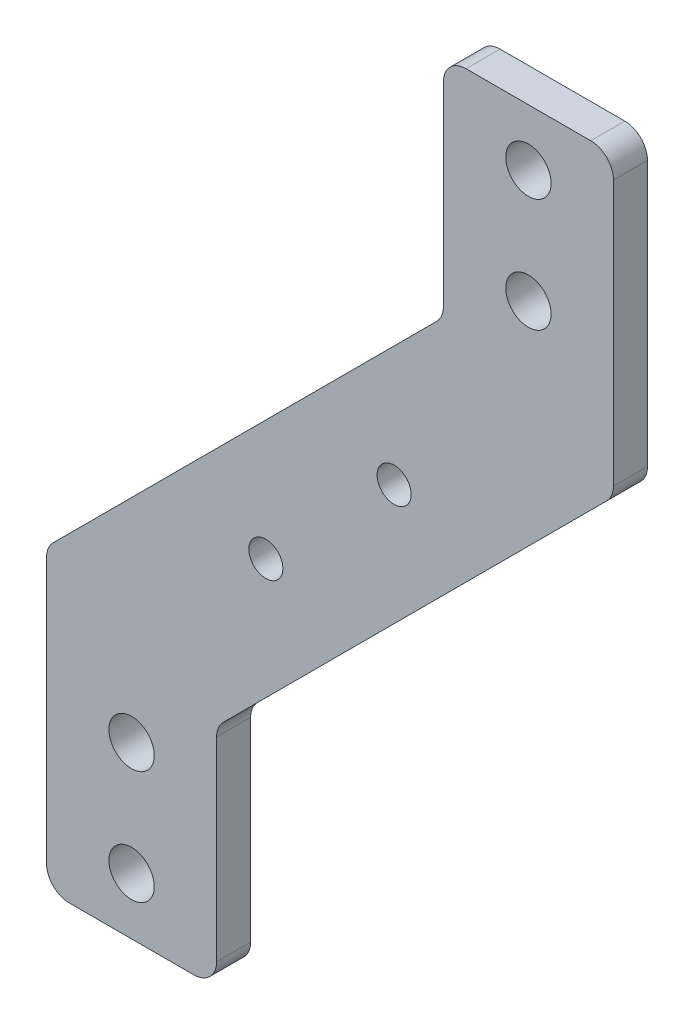
ISO-10303-21;
HEADER;
FILE_DESCRIPTION(('STEP AP214'),'2;1');
FILE_NAME('part.step','',(''),(''),'','','');
FILE_SCHEMA(('AUTOMOTIVE_DESIGN { 1 0 10303 214 1 1 1 1 }'));
ENDSEC;
DATA;
#1=APPLICATION_CONTEXT('core data for automotive mechanical design processes');
#2=APPLICATION_PROTOCOL_DEFINITION('international standard','automotive_design',2000,#1);
#3=PRODUCT_CONTEXT('',#1,'mechanical');
#4=PRODUCT('Part','Part','',(#3));
#5=PRODUCT_RELATED_PRODUCT_CATEGORY('part','',(#4));
#6=PRODUCT_DEFINITION_FORMATION('','',#4);
#7=PRODUCT_DEFINITION_CONTEXT('part definition',#1,'design');
#8=PRODUCT_DEFINITION('design','',#6,#7);
#9=PRODUCT_DEFINITION_SHAPE('','',#8);
#10=(LENGTH_UNIT() NAMED_UNIT(*) SI_UNIT(.MILLI.,.METRE.));
#11=(NAMED_UNIT(*) PLANE_ANGLE_UNIT() SI_UNIT($,.RADIAN.));
#12=(NAMED_UNIT(*) SI_UNIT($,.STERADIAN.) SOLID_ANGLE_UNIT());
#13=UNCERTAINTY_MEASURE_WITH_UNIT(LENGTH_MEASURE(1.E-05),#10,'distance_accuracy_value','');
#14=(GEOMETRIC_REPRESENTATION_CONTEXT(3) GLOBAL_UNCERTAINTY_ASSIGNED_CONTEXT((#13)) GLOBAL_UNIT_ASSIGNED_CONTEXT((#10,
#11,#12)) REPRESENTATION_CONTEXT('',''));
#15=CARTESIAN_POINT('',(0.,0.,0.));
#16=DIRECTION('',(0.,0.,1.));
#17=DIRECTION('',(1.,0.,0.));
#18=AXIS2_PLACEMENT_3D('',#15,#16,#17);
#19=CARTESIAN_POINT('',(0.,0.,3.));
#20=DIRECTION('',(0.,0.,-1.));
#21=DIRECTION('',(-1.,0.,0.));
#22=AXIS2_PLACEMENT_3D('',#19,#20,#21);
#23=PLANE('',#22);
#24=CARTESIAN_POINT('',(15.6568542494867,46.2634559672881,3.));
#25=DIRECTION('',(0.,0.,-1.));
#26=DIRECTION('',(-1.,0.,0.));
#27=AXIS2_PLACEMENT_3D('',#24,#25,#26);
#28=CIRCLE('',#27,1.5);
#29=CARTESIAN_POINT('',(14.1568542494867,46.2634559672881,3.));
#30=VERTEX_POINT('',#29);
#31=EDGE_CURVE('E415',#30,#30,#28,.T.);
#32=ORIENTED_EDGE('',*,*,#31,.T.);
#33=EDGE_LOOP('',(#32));
#34=FACE_BOUND('',#33,.T.);
#35=CARTESIAN_POINT('',(4.34314575050198,34.9497474683034,3.));
#36=DIRECTION('',(0.,0.,-1.));
#37=DIRECTION('',(-1.,0.,0.));
#38=AXIS2_PLACEMENT_3D('',#35,#36,#37);
#39=CIRCLE('',#38,1.5);
#40=CARTESIAN_POINT('',(2.84314575050198,34.9497474683034,3.));
#41=VERTEX_POINT('',#40);
#42=EDGE_CURVE('E420',#41,#41,#39,.T.);
#43=ORIENTED_EDGE('',*,*,#42,.T.);
#44=EDGE_LOOP('',(#43));
#45=FACE_BOUND('',#44,.T.);
#46=DIRECTION('',(1.,0.,0.));
#47=VECTOR('',#46,1.);
#48=CARTESIAN_POINT('',(0.,0.,3.));
#49=LINE('',#48,#47);
#50=CARTESIAN_POINT('',(-13.,0.,3.));
#51=VERTEX_POINT('',#50);
#52=CARTESIAN_POINT('',(-2.,0.,3.));
#53=VERTEX_POINT('',#52);
#54=EDGE_CURVE('E185',#51,#53,#49,.T.);
#55=ORIENTED_EDGE('',*,*,#54,.T.);
#56=CARTESIAN_POINT('',(-2.,2.,3.));
#57=DIRECTION('',(0.,0.,-1.));
#58=DIRECTION('',(-1.,0.,0.));
#59=AXIS2_PLACEMENT_3D('',#56,#57,#58);
#60=CIRCLE('',#59,2.);
#61=CARTESIAN_POINT('',(0.,2.,3.));
#62=VERTEX_POINT('',#61);
#63=EDGE_CURVE('E224',#53,#62,#60,.F.);
#64=ORIENTED_EDGE('',*,*,#63,.T.);
#65=DIRECTION('',(0.,1.,0.));
#66=VECTOR('',#65,1.);
#67=CARTESIAN_POINT('',(0.,20.,3.));
#68=LINE('',#67,#66);
#69=CARTESIAN_POINT('',(0.,19.1715728752538,3.));
#70=VERTEX_POINT('',#69);
#71=EDGE_CURVE('E168',#62,#70,#68,.T.);
#72=ORIENTED_EDGE('',*,*,#71,.T.);
#73=CARTESIAN_POINT('',(2.,19.1715728752538,3.));
#74=DIRECTION('',(0.,0.,-1.));
#75=DIRECTION('',(-1.,0.,0.));
#76=AXIS2_PLACEMENT_3D('',#73,#74,#75);
#77=CIRCLE('',#76,2.);
#78=CARTESIAN_POINT('',(0.585786437626898,20.5857864376269,3.));
#79=VERTEX_POINT('',#78);
#80=EDGE_CURVE('E11',#70,#79,#77,.T.);
#81=ORIENTED_EDGE('',*,*,#80,.T.);
#82=DIRECTION('',(0.70710678118655,0.707106781186545,0.));
#83=VECTOR('',#82,1.);
#84=CARTESIAN_POINT('',(35.,54.9999999999998,3.));
#85=LINE('',#84,#83);
#86=CARTESIAN_POINT('',(34.4142135623731,54.4142135623729,3.));
#87=VERTEX_POINT('',#86);
#88=EDGE_CURVE('E310',#79,#87,#85,.T.);
#89=ORIENTED_EDGE('',*,*,#88,.T.);
#90=CARTESIAN_POINT('',(33.,55.828427124746,3.));
#91=DIRECTION('',(0.,0.,-1.));
#92=DIRECTION('',(-1.,0.,0.));
#93=AXIS2_PLACEMENT_3D('',#90,#91,#92);
#94=CIRCLE('',#93,2.);
#95=CARTESIAN_POINT('',(35.,55.828427124746,3.));
#96=VERTEX_POINT('',#95);
#97=EDGE_CURVE('E217',#87,#96,#94,.F.);
#98=ORIENTED_EDGE('',*,*,#97,.T.);
#99=DIRECTION('',(0.,1.,0.));
#100=VECTOR('',#99,1.);
#101=CARTESIAN_POINT('',(35.,81.2132034355963,3.));
#102=LINE('',#101,#100);
#103=CARTESIAN_POINT('',(35.,79.2132034355963,3.));
#104=VERTEX_POINT('',#103);
#105=EDGE_CURVE('E300',#96,#104,#102,.T.);
#106=ORIENTED_EDGE('',*,*,#105,.T.);
#107=CARTESIAN_POINT('',(33.,79.2132034355963,3.));
#108=DIRECTION('',(0.,0.,-1.));
#109=DIRECTION('',(-1.,0.,0.));
#110=AXIS2_PLACEMENT_3D('',#107,#108,#109);
#111=CIRCLE('',#110,2.);
#112=CARTESIAN_POINT('',(33.,81.2132034355963,3.));
#113=VERTEX_POINT('',#112);
#114=EDGE_CURVE('E215',#104,#113,#111,.F.);
#115=ORIENTED_EDGE('',*,*,#114,.T.);
#116=DIRECTION('',(-1.,0.,0.));
#117=VECTOR('',#116,1.);
#118=CARTESIAN_POINT('',(20.,81.2132034355963,3.));
#119=LINE('',#118,#117);
#120=CARTESIAN_POINT('',(22.,81.2132034355963,3.));
#121=VERTEX_POINT('',#120);
#122=EDGE_CURVE('E290',#113,#121,#119,.T.);
#123=ORIENTED_EDGE('',*,*,#122,.T.);
#124=CARTESIAN_POINT('',(22.,79.2132034355963,3.));
#125=DIRECTION('',(0.,0.,-1.));
#126=DIRECTION('',(-1.,0.,0.));
#127=AXIS2_PLACEMENT_3D('',#124,#125,#126);
#128=CIRCLE('',#127,2.);
#129=CARTESIAN_POINT('',(20.,79.2132034355963,3.));
#130=VERTEX_POINT('',#129);
#131=EDGE_CURVE('E219',#121,#130,#128,.F.);
#132=ORIENTED_EDGE('',*,*,#131,.T.);
#133=DIRECTION('',(0.,-1.,0.));
#134=VECTOR('',#133,1.);
#135=CARTESIAN_POINT('',(20.,61.2132034355963,3.));
#136=LINE('',#135,#134);
#137=CARTESIAN_POINT('',(20.,62.0416305603425,3.));
#138=VERTEX_POINT('',#137);
#139=EDGE_CURVE('E265',#130,#138,#136,.T.);
#140=ORIENTED_EDGE('',*,*,#139,.T.);
#141=CARTESIAN_POINT('',(18.,62.0416305603425,3.));
#142=DIRECTION('',(0.,0.,-1.));
#143=DIRECTION('',(-1.,0.,0.));
#144=AXIS2_PLACEMENT_3D('',#141,#142,#143);
#145=CIRCLE('',#144,2.);
#146=CARTESIAN_POINT('',(19.4142135623731,60.6274169979694,3.));
#147=VERTEX_POINT('',#146);
#148=EDGE_CURVE('E257',#138,#147,#145,.T.);
#149=ORIENTED_EDGE('',*,*,#148,.T.);
#150=DIRECTION('',(-0.707106781186549,-0.707106781186546,0.));
#151=VECTOR('',#150,1.);
#152=CARTESIAN_POINT('',(-15.,26.2132034355964,3.));
#153=LINE('',#152,#151);
#154=CARTESIAN_POINT('',(-14.4142135623731,26.7989898732233,3.));
#155=VERTEX_POINT('',#154);
#156=EDGE_CURVE('E263',#147,#155,#153,.T.);
#157=ORIENTED_EDGE('',*,*,#156,.T.);
#158=CARTESIAN_POINT('',(-13.,25.3847763108502,3.));
#159=DIRECTION('',(0.,0.,-1.));
#160=DIRECTION('',(-1.,0.,0.));
#161=AXIS2_PLACEMENT_3D('',#158,#159,#160);
#162=CIRCLE('',#161,2.);
#163=CARTESIAN_POINT('',(-15.,25.3847763108502,3.));
#164=VERTEX_POINT('',#163);
#165=EDGE_CURVE('E56',#155,#164,#162,.F.);
#166=ORIENTED_EDGE('',*,*,#165,.T.);
#167=DIRECTION('',(0.,-1.,0.));
#168=VECTOR('',#167,1.);
#169=CARTESIAN_POINT('',(-15.,0.,3.));
#170=LINE('',#169,#168);
#171=CARTESIAN_POINT('',(-15.,2.,3.));
#172=VERTEX_POINT('',#171);
#173=EDGE_CURVE('E273',#164,#172,#170,.T.);
#174=ORIENTED_EDGE('',*,*,#173,.T.);
#175=CARTESIAN_POINT('',(-13.,2.,3.));
#176=DIRECTION('',(0.,0.,-1.));
#177=DIRECTION('',(-1.,0.,0.));
#178=AXIS2_PLACEMENT_3D('',#175,#176,#177);
#179=CIRCLE('',#178,2.);
#180=EDGE_CURVE('E222',#172,#51,#179,.F.);
#181=ORIENTED_EDGE('',*,*,#180,.T.);
#182=EDGE_LOOP('',(#55,#64,#72,#81,#89,#98,#106,#115,#123,#132,#140,#149,#157,#166,#174,#181));
#183=FACE_BOUND('',#182,.T.);
#184=CARTESIAN_POINT('',(-7.5,5.,3.));
#185=DIRECTION('',(0.,0.,1.));
#186=DIRECTION('',(1.,0.,0.));
#187=AXIS2_PLACEMENT_3D('',#184,#185,#186);
#188=CIRCLE('',#187,2.);
#189=CARTESIAN_POINT('',(-5.5,5.,3.));
#190=VERTEX_POINT('',#189);
#191=EDGE_CURVE('E176',#190,#190,#188,.T.);
#192=ORIENTED_EDGE('',*,*,#191,.F.);
#193=EDGE_LOOP('',(#192));
#194=FACE_BOUND('',#193,.T.);
#195=CARTESIAN_POINT('',(-7.5,15.,3.));
#196=DIRECTION('',(0.,0.,1.));
#197=DIRECTION('',(1.,0.,0.));
#198=AXIS2_PLACEMENT_3D('',#195,#196,#197);
#199=CIRCLE('',#198,2.);
#200=CARTESIAN_POINT('',(-5.5,15.,3.));
#201=VERTEX_POINT('',#200);
#202=EDGE_CURVE('E398',#201,#201,#199,.T.);
#203=ORIENTED_EDGE('',*,*,#202,.F.);
#204=EDGE_LOOP('',(#203));
#205=FACE_BOUND('',#204,.T.);
#206=CARTESIAN_POINT('',(27.5,76.2132034355963,3.));
#207=DIRECTION('',(0.,0.,1.));
#208=DIRECTION('',(1.,0.,0.));
#209=AXIS2_PLACEMENT_3D('',#206,#207,#208);
#210=CIRCLE('',#209,2.);
#211=CARTESIAN_POINT('',(29.5,76.2132034355963,3.));
#212=VERTEX_POINT('',#211);
#213=EDGE_CURVE('E402',#212,#212,#210,.T.);
#214=ORIENTED_EDGE('',*,*,#213,.F.);
#215=EDGE_LOOP('',(#214));
#216=FACE_BOUND('',#215,.T.);
#217=CARTESIAN_POINT('',(27.5,66.2132034355963,3.));
#218=DIRECTION('',(0.,0.,1.));
#219=DIRECTION('',(1.,0.,0.));
#220=AXIS2_PLACEMENT_3D('',#217,#218,#219);
#221=CIRCLE('',#220,2.);
#222=CARTESIAN_POINT('',(29.5,66.2132034355963,3.));
#223=VERTEX_POINT('',#222);
#224=EDGE_CURVE('E410',#223,#223,#221,.T.);
#225=ORIENTED_EDGE('',*,*,#224,.F.);
#226=EDGE_LOOP('',(#225));
#227=FACE_BOUND('',#226,.T.);
#228=ADVANCED_FACE('F34',(#34,#45,#183,#194,#205,#216,#227),#23,.F.);
#229=CARTESIAN_POINT('',(0.,0.,0.));
#230=DIRECTION('',(0.,0.,-1.));
#231=DIRECTION('',(-1.,0.,0.));
#232=AXIS2_PLACEMENT_3D('',#229,#230,#231);
#233=PLANE('',#232);
#234=CARTESIAN_POINT('',(15.6568542494867,46.2634559672881,0.));
#235=DIRECTION('',(0.,0.,-1.));
#236=DIRECTION('',(-1.,0.,0.));
#237=AXIS2_PLACEMENT_3D('',#234,#235,#236);
#238=CIRCLE('',#237,1.5);
#239=CARTESIAN_POINT('',(14.1568542494867,46.2634559672881,0.));
#240=VERTEX_POINT('',#239);
#241=EDGE_CURVE('E423',#240,#240,#238,.T.);
#242=ORIENTED_EDGE('',*,*,#241,.F.);
#243=EDGE_LOOP('',(#242));
#244=FACE_BOUND('',#243,.T.);
#245=CARTESIAN_POINT('',(4.34314575050198,34.9497474683034,0.));
#246=DIRECTION('',(0.,0.,-1.));
#247=DIRECTION('',(-1.,0.,0.));
#248=AXIS2_PLACEMENT_3D('',#245,#246,#247);
#249=CIRCLE('',#248,1.5);
#250=CARTESIAN_POINT('',(2.84314575050198,34.9497474683034,0.));
#251=VERTEX_POINT('',#250);
#252=EDGE_CURVE('E417',#251,#251,#249,.T.);
#253=ORIENTED_EDGE('',*,*,#252,.F.);
#254=EDGE_LOOP('',(#253));
#255=FACE_BOUND('',#254,.T.);
#256=CARTESIAN_POINT('',(27.5,76.2132034355963,0.));
#257=DIRECTION('',(0.,0.,1.));
#258=DIRECTION('',(1.,0.,0.));
#259=AXIS2_PLACEMENT_3D('',#256,#257,#258);
#260=CIRCLE('',#259,2.);
#261=CARTESIAN_POINT('',(29.5,76.2132034355963,0.));
#262=VERTEX_POINT('',#261);
#263=EDGE_CURVE('E406',#262,#262,#260,.T.);
#264=ORIENTED_EDGE('',*,*,#263,.T.);
#265=EDGE_LOOP('',(#264));
#266=FACE_BOUND('',#265,.T.);
#267=CARTESIAN_POINT('',(-7.5,5.,0.));
#268=DIRECTION('',(0.,0.,1.));
#269=DIRECTION('',(1.,0.,0.));
#270=AXIS2_PLACEMENT_3D('',#267,#268,#269);
#271=CIRCLE('',#270,2.);
#272=CARTESIAN_POINT('',(-5.5,5.,0.));
#273=VERTEX_POINT('',#272);
#274=EDGE_CURVE('E182',#273,#273,#271,.T.);
#275=ORIENTED_EDGE('',*,*,#274,.T.);
#276=EDGE_LOOP('',(#275));
#277=FACE_BOUND('',#276,.T.);
#278=DIRECTION('',(0.,1.,0.));
#279=VECTOR('',#278,1.);
#280=CARTESIAN_POINT('',(0.,20.,0.));
#281=LINE('',#280,#279);
#282=CARTESIAN_POINT('',(0.,2.,0.));
#283=VERTEX_POINT('',#282);
#284=CARTESIAN_POINT('',(0.,19.1715728752538,0.));
#285=VERTEX_POINT('',#284);
#286=EDGE_CURVE('E165',#283,#285,#281,.T.);
#287=ORIENTED_EDGE('',*,*,#286,.F.);
#288=CARTESIAN_POINT('',(-2.,2.,0.));
#289=DIRECTION('',(0.,0.,-1.));
#290=DIRECTION('',(-1.,0.,0.));
#291=AXIS2_PLACEMENT_3D('',#288,#289,#290);
#292=CIRCLE('',#291,2.);
#293=CARTESIAN_POINT('',(-2.,0.,0.));
#294=VERTEX_POINT('',#293);
#295=EDGE_CURVE('E148',#283,#294,#292,.T.);
#296=ORIENTED_EDGE('',*,*,#295,.T.);
#297=DIRECTION('',(1.,0.,0.));
#298=VECTOR('',#297,1.);
#299=CARTESIAN_POINT('',(0.,0.,0.));
#300=LINE('',#299,#298);
#301=CARTESIAN_POINT('',(-13.,0.,0.));
#302=VERTEX_POINT('',#301);
#303=EDGE_CURVE('E201',#302,#294,#300,.T.);
#304=ORIENTED_EDGE('',*,*,#303,.F.);
#305=CARTESIAN_POINT('',(-13.,2.,0.));
#306=DIRECTION('',(0.,0.,-1.));
#307=DIRECTION('',(-1.,0.,0.));
#308=AXIS2_PLACEMENT_3D('',#305,#306,#307);
#309=CIRCLE('',#308,2.);
#310=CARTESIAN_POINT('',(-15.,2.,0.));
#311=VERTEX_POINT('',#310);
#312=EDGE_CURVE('E159',#302,#311,#309,.T.);
#313=ORIENTED_EDGE('',*,*,#312,.T.);
#314=DIRECTION('',(0.,-1.,0.));
#315=VECTOR('',#314,1.);
#316=CARTESIAN_POINT('',(-15.,0.,0.));
#317=LINE('',#316,#315);
#318=CARTESIAN_POINT('',(-15.,25.3847763108502,0.));
#319=VERTEX_POINT('',#318);
#320=EDGE_CURVE('E199',#319,#311,#317,.T.);
#321=ORIENTED_EDGE('',*,*,#320,.F.);
#322=CARTESIAN_POINT('',(-13.,25.3847763108502,0.));
#323=DIRECTION('',(0.,0.,-1.));
#324=DIRECTION('',(-1.,0.,0.));
#325=AXIS2_PLACEMENT_3D('',#322,#323,#324);
#326=CIRCLE('',#325,2.);
#327=CARTESIAN_POINT('',(-14.4142135623731,26.7989898732233,0.));
#328=VERTEX_POINT('',#327);
#329=EDGE_CURVE('E209',#319,#328,#326,.T.);
#330=ORIENTED_EDGE('',*,*,#329,.T.);
#331=DIRECTION('',(-0.707106781186549,-0.707106781186546,0.));
#332=VECTOR('',#331,1.);
#333=CARTESIAN_POINT('',(-15.,26.2132034355964,0.));
#334=LINE('',#333,#332);
#335=CARTESIAN_POINT('',(19.4142135623731,60.6274169979694,0.));
#336=VERTEX_POINT('',#335);
#337=EDGE_CURVE('E196',#336,#328,#334,.T.);
#338=ORIENTED_EDGE('',*,*,#337,.F.);
#339=CARTESIAN_POINT('',(18.,62.0416305603425,0.));
#340=DIRECTION('',(0.,0.,-1.));
#341=DIRECTION('',(-1.,0.,0.));
#342=AXIS2_PLACEMENT_3D('',#339,#340,#341);
#343=CIRCLE('',#342,2.);
#344=CARTESIAN_POINT('',(20.,62.0416305603425,0.));
#345=VERTEX_POINT('',#344);
#346=EDGE_CURVE('E255',#336,#345,#343,.F.);
#347=ORIENTED_EDGE('',*,*,#346,.T.);
#348=DIRECTION('',(0.,-1.,0.));
#349=VECTOR('',#348,1.);
#350=CARTESIAN_POINT('',(20.,61.2132034355963,0.));
#351=LINE('',#350,#349);
#352=CARTESIAN_POINT('',(20.,79.2132034355963,0.));
#353=VERTEX_POINT('',#352);
#354=EDGE_CURVE('E193',#353,#345,#351,.T.);
#355=ORIENTED_EDGE('',*,*,#354,.F.);
#356=CARTESIAN_POINT('',(22.,79.2132034355963,0.));
#357=DIRECTION('',(0.,0.,-1.));
#358=DIRECTION('',(-1.,0.,0.));
#359=AXIS2_PLACEMENT_3D('',#356,#357,#358);
#360=CIRCLE('',#359,2.);
#361=CARTESIAN_POINT('',(22.,81.2132034355963,0.));
#362=VERTEX_POINT('',#361);
#363=EDGE_CURVE('E207',#353,#362,#360,.T.);
#364=ORIENTED_EDGE('',*,*,#363,.T.);
#365=DIRECTION('',(-1.,0.,0.));
#366=VECTOR('',#365,1.);
#367=CARTESIAN_POINT('',(20.,81.2132034355963,0.));
#368=LINE('',#367,#366);
#369=CARTESIAN_POINT('',(33.,81.2132034355963,0.));
#370=VERTEX_POINT('',#369);
#371=EDGE_CURVE('E190',#370,#362,#368,.T.);
#372=ORIENTED_EDGE('',*,*,#371,.F.);
#373=CARTESIAN_POINT('',(33.,79.2132034355963,0.));
#374=DIRECTION('',(0.,0.,-1.));
#375=DIRECTION('',(-1.,0.,0.));
#376=AXIS2_PLACEMENT_3D('',#373,#374,#375);
#377=CIRCLE('',#376,2.);
#378=CARTESIAN_POINT('',(35.,79.2132034355963,0.));
#379=VERTEX_POINT('',#378);
#380=EDGE_CURVE('E169',#370,#379,#377,.T.);
#381=ORIENTED_EDGE('',*,*,#380,.T.);
#382=DIRECTION('',(0.,1.,0.));
#383=VECTOR('',#382,1.);
#384=CARTESIAN_POINT('',(35.,81.2132034355963,0.));
#385=LINE('',#384,#383);
#386=CARTESIAN_POINT('',(35.,55.828427124746,0.));
#387=VERTEX_POINT('',#386);
#388=EDGE_CURVE('E179',#387,#379,#385,.T.);
#389=ORIENTED_EDGE('',*,*,#388,.F.);
#390=CARTESIAN_POINT('',(33.,55.828427124746,0.));
#391=DIRECTION('',(0.,0.,-1.));
#392=DIRECTION('',(-1.,0.,0.));
#393=AXIS2_PLACEMENT_3D('',#390,#391,#392);
#394=CIRCLE('',#393,2.);
#395=CARTESIAN_POINT('',(34.4142135623731,54.4142135623729,0.));
#396=VERTEX_POINT('',#395);
#397=EDGE_CURVE('E205',#387,#396,#394,.T.);
#398=ORIENTED_EDGE('',*,*,#397,.T.);
#399=DIRECTION('',(0.70710678118655,0.707106781186545,0.));
#400=VECTOR('',#399,1.);
#401=CARTESIAN_POINT('',(35.,54.9999999999998,0.));
#402=LINE('',#401,#400);
#403=CARTESIAN_POINT('',(0.585786437626898,20.5857864376269,0.));
#404=VERTEX_POINT('',#403);
#405=EDGE_CURVE('E175',#404,#396,#402,.T.);
#406=ORIENTED_EDGE('',*,*,#405,.F.);
#407=CARTESIAN_POINT('',(2.,19.1715728752538,0.));
#408=DIRECTION('',(0.,0.,-1.));
#409=DIRECTION('',(-1.,0.,0.));
#410=AXIS2_PLACEMENT_3D('',#407,#408,#409);
#411=CIRCLE('',#410,2.);
#412=EDGE_CURVE('E42',#404,#285,#411,.F.);
#413=ORIENTED_EDGE('',*,*,#412,.T.);
#414=EDGE_LOOP('',(#287,#296,#304,#313,#321,#330,#338,#347,#355,#364,#372,#381,#389,#398,#406,#413));
#415=FACE_BOUND('',#414,.T.);
#416=CARTESIAN_POINT('',(-7.5,15.,0.));
#417=DIRECTION('',(0.,0.,1.));
#418=DIRECTION('',(1.,0.,0.));
#419=AXIS2_PLACEMENT_3D('',#416,#417,#418);
#420=CIRCLE('',#419,2.);
#421=CARTESIAN_POINT('',(-5.5,15.,0.));
#422=VERTEX_POINT('',#421);
#423=EDGE_CURVE('E401',#422,#422,#420,.T.);
#424=ORIENTED_EDGE('',*,*,#423,.T.);
#425=EDGE_LOOP('',(#424));
#426=FACE_BOUND('',#425,.T.);
#427=CARTESIAN_POINT('',(27.5,66.2132034355963,0.));
#428=DIRECTION('',(0.,0.,1.));
#429=DIRECTION('',(1.,0.,0.));
#430=AXIS2_PLACEMENT_3D('',#427,#428,#429);
#431=CIRCLE('',#430,2.);
#432=CARTESIAN_POINT('',(29.5,66.2132034355963,0.));
#433=VERTEX_POINT('',#432);
#434=EDGE_CURVE('E412',#433,#433,#431,.T.);
#435=ORIENTED_EDGE('',*,*,#434,.T.);
#436=EDGE_LOOP('',(#435));
#437=FACE_BOUND('',#436,.T.);
#438=ADVANCED_FACE('F172',(#244,#255,#266,#277,#415,#426,#437),#233,.T.);
#439=CARTESIAN_POINT('',(0.,20.,3.));
#440=DIRECTION('',(-1.,0.,0.));
#441=DIRECTION('',(0.,-1.,0.));
#442=AXIS2_PLACEMENT_3D('',#439,#440,#441);
#443=PLANE('',#442);
#444=ORIENTED_EDGE('',*,*,#71,.F.);
#445=DIRECTION('',(0.,0.,-1.));
#446=VECTOR('',#445,1.);
#447=CARTESIAN_POINT('',(0.,2.,3.));
#448=LINE('',#447,#446);
#449=EDGE_CURVE('E152',#62,#283,#448,.T.);
#450=ORIENTED_EDGE('',*,*,#449,.T.);
#451=ORIENTED_EDGE('',*,*,#286,.T.);
#452=DIRECTION('',(0.,0.,-1.));
#453=VECTOR('',#452,1.);
#454=CARTESIAN_POINT('',(0.,19.1715728752538,3.));
#455=LINE('',#454,#453);
#456=EDGE_CURVE('E170',#285,#70,#455,.F.);
#457=ORIENTED_EDGE('',*,*,#456,.T.);
#458=EDGE_LOOP('',(#444,#450,#451,#457));
#459=FACE_BOUND('',#458,.T.);
#460=ADVANCED_FACE('F164',(#459),#443,.F.);
#461=CARTESIAN_POINT('',(35.,54.9999999999998,3.));
#462=DIRECTION('',(-0.707106781186545,0.70710678118655,0.));
#463=DIRECTION('',(-0.70710678118655,-0.707106781186545,0.));
#464=AXIS2_PLACEMENT_3D('',#461,#462,#463);
#465=PLANE('',#464);
#466=ORIENTED_EDGE('',*,*,#405,.T.);
#467=DIRECTION('',(0.,0.,-1.));
#468=VECTOR('',#467,1.);
#469=CARTESIAN_POINT('',(34.4142135623731,54.4142135623729,3.));
#470=LINE('',#469,#468);
#471=EDGE_CURVE('E253',#396,#87,#470,.F.);
#472=ORIENTED_EDGE('',*,*,#471,.T.);
#473=ORIENTED_EDGE('',*,*,#88,.F.);
#474=DIRECTION('',(0.,0.,-1.));
#475=VECTOR('',#474,1.);
#476=CARTESIAN_POINT('',(0.585786437626912,20.5857864376269,0.));
#477=LINE('',#476,#475);
#478=EDGE_CURVE('E250',#79,#404,#477,.T.);
#479=ORIENTED_EDGE('',*,*,#478,.T.);
#480=EDGE_LOOP('',(#466,#472,#473,#479));
#481=FACE_BOUND('',#480,.T.);
#482=ADVANCED_FACE('F306',(#481),#465,.F.);
#483=CARTESIAN_POINT('',(35.,81.2132034355963,3.));
#484=DIRECTION('',(-1.,0.,0.));
#485=DIRECTION('',(0.,-1.,0.));
#486=AXIS2_PLACEMENT_3D('',#483,#484,#485);
#487=PLANE('',#486);
#488=ORIENTED_EDGE('',*,*,#105,.F.);
#489=DIRECTION('',(0.,0.,-1.));
#490=VECTOR('',#489,1.);
#491=CARTESIAN_POINT('',(35.,55.828427124746,3.));
#492=LINE('',#491,#490);
#493=EDGE_CURVE('E247',#96,#387,#492,.T.);
#494=ORIENTED_EDGE('',*,*,#493,.T.);
#495=ORIENTED_EDGE('',*,*,#388,.T.);
#496=DIRECTION('',(0.,0.,-1.));
#497=VECTOR('',#496,1.);
#498=CARTESIAN_POINT('',(35.,79.2132034355963,3.));
#499=LINE('',#498,#497);
#500=EDGE_CURVE('E245',#379,#104,#499,.F.);
#501=ORIENTED_EDGE('',*,*,#500,.T.);
#502=EDGE_LOOP('',(#488,#494,#495,#501));
#503=FACE_BOUND('',#502,.T.);
#504=ADVANCED_FACE('F297',(#503),#487,.F.);
#505=CARTESIAN_POINT('',(20.,81.2132034355963,3.));
#506=DIRECTION('',(0.,-1.,0.));
#507=DIRECTION('',(0.,0.,-1.));
#508=AXIS2_PLACEMENT_3D('',#505,#506,#507);
#509=PLANE('',#508);
#510=ORIENTED_EDGE('',*,*,#371,.T.);
#511=DIRECTION('',(0.,0.,-1.));
#512=VECTOR('',#511,1.);
#513=CARTESIAN_POINT('',(22.,81.2132034355963,3.));
#514=LINE('',#513,#512);
#515=EDGE_CURVE('E243',#362,#121,#514,.F.);
#516=ORIENTED_EDGE('',*,*,#515,.T.);
#517=ORIENTED_EDGE('',*,*,#122,.F.);
#518=DIRECTION('',(0.,0.,-1.));
#519=VECTOR('',#518,1.);
#520=CARTESIAN_POINT('',(33.,81.2132034355963,3.));
#521=LINE('',#520,#519);
#522=EDGE_CURVE('E240',#113,#370,#521,.T.);
#523=ORIENTED_EDGE('',*,*,#522,.T.);
#524=EDGE_LOOP('',(#510,#516,#517,#523));
#525=FACE_BOUND('',#524,.T.);
#526=ADVANCED_FACE('F286',(#525),#509,.F.);
#527=CARTESIAN_POINT('',(20.,61.2132034355963,3.));
#528=DIRECTION('',(1.,0.,0.));
#529=DIRECTION('',(0.,1.,0.));
#530=AXIS2_PLACEMENT_3D('',#527,#528,#529);
#531=PLANE('',#530);
#532=ORIENTED_EDGE('',*,*,#354,.T.);
#533=DIRECTION('',(0.,0.,-1.));
#534=VECTOR('',#533,1.);
#535=CARTESIAN_POINT('',(20.,62.0416305603425,3.));
#536=LINE('',#535,#534);
#537=EDGE_CURVE('E238',#345,#138,#536,.F.);
#538=ORIENTED_EDGE('',*,*,#537,.T.);
#539=ORIENTED_EDGE('',*,*,#139,.F.);
#540=DIRECTION('',(0.,0.,-1.));
#541=VECTOR('',#540,1.);
#542=CARTESIAN_POINT('',(20.,79.2132034355963,3.));
#543=LINE('',#542,#541);
#544=EDGE_CURVE('E235',#130,#353,#543,.T.);
#545=ORIENTED_EDGE('',*,*,#544,.T.);
#546=EDGE_LOOP('',(#532,#538,#539,#545));
#547=FACE_BOUND('',#546,.T.);
#548=ADVANCED_FACE('F278',(#547),#531,.F.);
#549=CARTESIAN_POINT('',(-15.,26.2132034355964,3.));
#550=DIRECTION('',(0.707106781186546,-0.707106781186548,0.));
#551=DIRECTION('',(0.707106781186549,0.707106781186546,0.));
#552=AXIS2_PLACEMENT_3D('',#549,#550,#551);
#553=PLANE('',#552);
#554=ORIENTED_EDGE('',*,*,#337,.T.);
#555=DIRECTION('',(0.,0.,-1.));
#556=VECTOR('',#555,1.);
#557=CARTESIAN_POINT('',(-14.4142135623731,26.7989898732233,3.));
#558=LINE('',#557,#556);
#559=EDGE_CURVE('E233',#328,#155,#558,.F.);
#560=ORIENTED_EDGE('',*,*,#559,.T.);
#561=ORIENTED_EDGE('',*,*,#156,.F.);
#562=DIRECTION('',(0.,0.,-1.));
#563=VECTOR('',#562,1.);
#564=CARTESIAN_POINT('',(19.4142135623731,60.6274169979694,0.));
#565=LINE('',#564,#563);
#566=EDGE_CURVE('E230',#147,#336,#565,.T.);
#567=ORIENTED_EDGE('',*,*,#566,.T.);
#568=EDGE_LOOP('',(#554,#560,#561,#567));
#569=FACE_BOUND('',#568,.T.);
#570=ADVANCED_FACE('F270',(#569),#553,.F.);
#571=CARTESIAN_POINT('',(-15.,0.,3.));
#572=DIRECTION('',(1.,0.,0.));
#573=DIRECTION('',(0.,0.,-1.));
#574=AXIS2_PLACEMENT_3D('',#571,#572,#573);
#575=PLANE('',#574);
#576=ORIENTED_EDGE('',*,*,#320,.T.);
#577=DIRECTION('',(0.,0.,-1.));
#578=VECTOR('',#577,1.);
#579=CARTESIAN_POINT('',(-15.,2.,3.));
#580=LINE('',#579,#578);
#581=EDGE_CURVE('E49',#311,#172,#580,.F.);
#582=ORIENTED_EDGE('',*,*,#581,.T.);
#583=ORIENTED_EDGE('',*,*,#173,.F.);
#584=DIRECTION('',(0.,0.,-1.));
#585=VECTOR('',#584,1.);
#586=CARTESIAN_POINT('',(-15.,25.3847763108502,3.));
#587=LINE('',#586,#585);
#588=EDGE_CURVE('E226',#164,#319,#587,.T.);
#589=ORIENTED_EDGE('',*,*,#588,.T.);
#590=EDGE_LOOP('',(#576,#582,#583,#589));
#591=FACE_BOUND('',#590,.T.);
#592=ADVANCED_FACE('F328',(#591),#575,.F.);
#593=CARTESIAN_POINT('',(0.,0.,3.));
#594=DIRECTION('',(0.,1.,0.));
#595=DIRECTION('',(0.,0.,1.));
#596=AXIS2_PLACEMENT_3D('',#593,#594,#595);
#597=PLANE('',#596);
#598=ORIENTED_EDGE('',*,*,#303,.T.);
#599=DIRECTION('',(0.,0.,-1.));
#600=VECTOR('',#599,1.);
#601=CARTESIAN_POINT('',(-2.,0.,3.));
#602=LINE('',#601,#600);
#603=EDGE_CURVE('E153',#294,#53,#602,.F.);
#604=ORIENTED_EDGE('',*,*,#603,.T.);
#605=ORIENTED_EDGE('',*,*,#54,.F.);
#606=DIRECTION('',(0.,0.,-1.));
#607=VECTOR('',#606,1.);
#608=CARTESIAN_POINT('',(-13.,0.,3.));
#609=LINE('',#608,#607);
#610=EDGE_CURVE('E158',#51,#302,#609,.T.);
#611=ORIENTED_EDGE('',*,*,#610,.T.);
#612=EDGE_LOOP('',(#598,#604,#605,#611));
#613=FACE_BOUND('',#612,.T.);
#614=ADVANCED_FACE('F324',(#613),#597,.F.);
#615=CARTESIAN_POINT('',(-7.5,5.,3.));
#616=DIRECTION('',(0.,0.,-1.));
#617=DIRECTION('',(-1.,0.,0.));
#618=AXIS2_PLACEMENT_3D('',#615,#616,#617);
#619=CYLINDRICAL_SURFACE('',#618,2.);
#620=ORIENTED_EDGE('',*,*,#191,.T.);
#621=EDGE_LOOP('',(#620));
#622=FACE_BOUND('',#621,.T.);
#623=ORIENTED_EDGE('',*,*,#274,.F.);
#624=EDGE_LOOP('',(#623));
#625=FACE_BOUND('',#624,.T.);
#626=ADVANCED_FACE('F351',(#622,#625),#619,.F.);
#627=CARTESIAN_POINT('',(-7.5,15.,3.));
#628=DIRECTION('',(0.,0.,-1.));
#629=DIRECTION('',(-1.,0.,0.));
#630=AXIS2_PLACEMENT_3D('',#627,#628,#629);
#631=CYLINDRICAL_SURFACE('',#630,2.);
#632=ORIENTED_EDGE('',*,*,#202,.T.);
#633=EDGE_LOOP('',(#632));
#634=FACE_BOUND('',#633,.T.);
#635=ORIENTED_EDGE('',*,*,#423,.F.);
#636=EDGE_LOOP('',(#635));
#637=FACE_BOUND('',#636,.T.);
#638=ADVANCED_FACE('F381',(#634,#637),#631,.F.);
#639=CARTESIAN_POINT('',(27.5,76.2132034355963,3.));
#640=DIRECTION('',(0.,0.,-1.));
#641=DIRECTION('',(-1.,0.,0.));
#642=AXIS2_PLACEMENT_3D('',#639,#640,#641);
#643=CYLINDRICAL_SURFACE('',#642,2.);
#644=ORIENTED_EDGE('',*,*,#213,.T.);
#645=EDGE_LOOP('',(#644));
#646=FACE_BOUND('',#645,.T.);
#647=ORIENTED_EDGE('',*,*,#263,.F.);
#648=EDGE_LOOP('',(#647));
#649=FACE_BOUND('',#648,.T.);
#650=ADVANCED_FACE('F375',(#646,#649),#643,.F.);
#651=CARTESIAN_POINT('',(27.5,66.2132034355963,3.));
#652=DIRECTION('',(0.,0.,-1.));
#653=DIRECTION('',(-1.,0.,0.));
#654=AXIS2_PLACEMENT_3D('',#651,#652,#653);
#655=CYLINDRICAL_SURFACE('',#654,2.);
#656=ORIENTED_EDGE('',*,*,#224,.T.);
#657=EDGE_LOOP('',(#656));
#658=FACE_BOUND('',#657,.T.);
#659=ORIENTED_EDGE('',*,*,#434,.F.);
#660=EDGE_LOOP('',(#659));
#661=FACE_BOUND('',#660,.T.);
#662=ADVANCED_FACE('F371',(#658,#661),#655,.F.);
#663=CARTESIAN_POINT('',(-2.,2.,3.));
#664=DIRECTION('',(0.,0.,-1.));
#665=DIRECTION('',(-1.,0.,0.));
#666=AXIS2_PLACEMENT_3D('',#663,#664,#665);
#667=CYLINDRICAL_SURFACE('',#666,2.);
#668=ORIENTED_EDGE('',*,*,#63,.F.);
#669=ORIENTED_EDGE('',*,*,#603,.F.);
#670=ORIENTED_EDGE('',*,*,#295,.F.);
#671=ORIENTED_EDGE('',*,*,#449,.F.);
#672=EDGE_LOOP('',(#668,#669,#670,#671));
#673=FACE_BOUND('',#672,.T.);
#674=ADVANCED_FACE('F151',(#673),#667,.T.);
#675=CARTESIAN_POINT('',(-13.,2.,3.));
#676=DIRECTION('',(0.,0.,-1.));
#677=DIRECTION('',(-1.,0.,0.));
#678=AXIS2_PLACEMENT_3D('',#675,#676,#677);
#679=CYLINDRICAL_SURFACE('',#678,2.);
#680=ORIENTED_EDGE('',*,*,#180,.F.);
#681=ORIENTED_EDGE('',*,*,#581,.F.);
#682=ORIENTED_EDGE('',*,*,#312,.F.);
#683=ORIENTED_EDGE('',*,*,#610,.F.);
#684=EDGE_LOOP('',(#680,#681,#682,#683));
#685=FACE_BOUND('',#684,.T.);
#686=ADVANCED_FACE('F326',(#685),#679,.T.);
#687=CARTESIAN_POINT('',(-13.,25.3847763108502,3.));
#688=DIRECTION('',(0.,0.,-1.));
#689=DIRECTION('',(-1.,0.,0.));
#690=AXIS2_PLACEMENT_3D('',#687,#688,#689);
#691=CYLINDRICAL_SURFACE('',#690,2.);
#692=ORIENTED_EDGE('',*,*,#165,.F.);
#693=ORIENTED_EDGE('',*,*,#559,.F.);
#694=ORIENTED_EDGE('',*,*,#329,.F.);
#695=ORIENTED_EDGE('',*,*,#588,.F.);
#696=EDGE_LOOP('',(#692,#693,#694,#695));
#697=FACE_BOUND('',#696,.T.);
#698=ADVANCED_FACE('F331',(#697),#691,.T.);
#699=CARTESIAN_POINT('',(18.,62.0416305603425,3.));
#700=DIRECTION('',(0.,0.,1.));
#701=DIRECTION('',(1.,0.,0.));
#702=AXIS2_PLACEMENT_3D('',#699,#700,#701);
#703=CYLINDRICAL_SURFACE('',#702,2.);
#704=ORIENTED_EDGE('',*,*,#148,.F.);
#705=ORIENTED_EDGE('',*,*,#537,.F.);
#706=ORIENTED_EDGE('',*,*,#346,.F.);
#707=ORIENTED_EDGE('',*,*,#566,.F.);
#708=EDGE_LOOP('',(#704,#705,#706,#707));
#709=FACE_BOUND('',#708,.T.);
#710=ADVANCED_FACE('F275',(#709),#703,.F.);
#711=CARTESIAN_POINT('',(22.,79.2132034355963,3.));
#712=DIRECTION('',(0.,0.,-1.));
#713=DIRECTION('',(-1.,0.,0.));
#714=AXIS2_PLACEMENT_3D('',#711,#712,#713);
#715=CYLINDRICAL_SURFACE('',#714,2.);
#716=ORIENTED_EDGE('',*,*,#131,.F.);
#717=ORIENTED_EDGE('',*,*,#515,.F.);
#718=ORIENTED_EDGE('',*,*,#363,.F.);
#719=ORIENTED_EDGE('',*,*,#544,.F.);
#720=EDGE_LOOP('',(#716,#717,#718,#719));
#721=FACE_BOUND('',#720,.T.);
#722=ADVANCED_FACE('F282',(#721),#715,.T.);
#723=CARTESIAN_POINT('',(33.,55.828427124746,3.));
#724=DIRECTION('',(0.,0.,-1.));
#725=DIRECTION('',(-1.,0.,0.));
#726=AXIS2_PLACEMENT_3D('',#723,#724,#725);
#727=CYLINDRICAL_SURFACE('',#726,2.);
#728=ORIENTED_EDGE('',*,*,#97,.F.);
#729=ORIENTED_EDGE('',*,*,#471,.F.);
#730=ORIENTED_EDGE('',*,*,#397,.F.);
#731=ORIENTED_EDGE('',*,*,#493,.F.);
#732=EDGE_LOOP('',(#728,#729,#730,#731));
#733=FACE_BOUND('',#732,.T.);
#734=ADVANCED_FACE('F303',(#733),#727,.T.);
#735=CARTESIAN_POINT('',(2.,19.1715728752538,3.));
#736=DIRECTION('',(0.,0.,1.));
#737=DIRECTION('',(1.,0.,0.));
#738=AXIS2_PLACEMENT_3D('',#735,#736,#737);
#739=CYLINDRICAL_SURFACE('',#738,2.);
#740=ORIENTED_EDGE('',*,*,#80,.F.);
#741=ORIENTED_EDGE('',*,*,#456,.F.);
#742=ORIENTED_EDGE('',*,*,#412,.F.);
#743=ORIENTED_EDGE('',*,*,#478,.F.);
#744=EDGE_LOOP('',(#740,#741,#742,#743));
#745=FACE_BOUND('',#744,.T.);
#746=ADVANCED_FACE('F313',(#745),#739,.F.);
#747=CARTESIAN_POINT('',(33.,79.2132034355963,3.));
#748=DIRECTION('',(0.,0.,-1.));
#749=DIRECTION('',(-1.,0.,0.));
#750=AXIS2_PLACEMENT_3D('',#747,#748,#749);
#751=CYLINDRICAL_SURFACE('',#750,2.);
#752=ORIENTED_EDGE('',*,*,#114,.F.);
#753=ORIENTED_EDGE('',*,*,#500,.F.);
#754=ORIENTED_EDGE('',*,*,#380,.F.);
#755=ORIENTED_EDGE('',*,*,#522,.F.);
#756=EDGE_LOOP('',(#752,#753,#754,#755));
#757=FACE_BOUND('',#756,.T.);
#758=ADVANCED_FACE('F36',(#757),#751,.T.);
#759=CARTESIAN_POINT('',(4.34314575050198,34.9497474683034,3.));
#760=DIRECTION('',(0.,0.,-1.));
#761=DIRECTION('',(-1.,0.,0.));
#762=AXIS2_PLACEMENT_3D('',#759,#760,#761);
#763=CYLINDRICAL_SURFACE('',#762,1.5);
#764=ORIENTED_EDGE('',*,*,#42,.F.);
#765=EDGE_LOOP('',(#764));
#766=FACE_BOUND('',#765,.T.);
#767=ORIENTED_EDGE('',*,*,#252,.T.);
#768=EDGE_LOOP('',(#767));
#769=FACE_BOUND('',#768,.T.);
#770=ADVANCED_FACE('F387',(#766,#769),#763,.F.);
#771=CARTESIAN_POINT('',(15.6568542494867,46.2634559672881,3.));
#772=DIRECTION('',(0.,0.,-1.));
#773=DIRECTION('',(-1.,0.,0.));
#774=AXIS2_PLACEMENT_3D('',#771,#772,#773);
#775=CYLINDRICAL_SURFACE('',#774,1.5);
#776=ORIENTED_EDGE('',*,*,#31,.F.);
#777=EDGE_LOOP('',(#776));
#778=FACE_BOUND('',#777,.T.);
#779=ORIENTED_EDGE('',*,*,#241,.T.);
#780=EDGE_LOOP('',(#779));
#781=FACE_BOUND('',#780,.T.);
#782=ADVANCED_FACE('F428',(#778,#781),#775,.F.);
#783=CLOSED_SHELL('',(#228,#438,#460,#482,#504,#526,#548,#570,#592,#614,#626,#638,#650,#662,
#674,#686,#698,#710,#722,#734,#746,#758,#770,#782));
#784=MANIFOLD_SOLID_BREP('B2',#783);
#785=ADVANCED_BREP_SHAPE_REPRESENTATION('',(#18,#784),#14);
#786=SHAPE_DEFINITION_REPRESENTATION(#9,#785);
ENDSEC;
END-ISO-10303-21;
